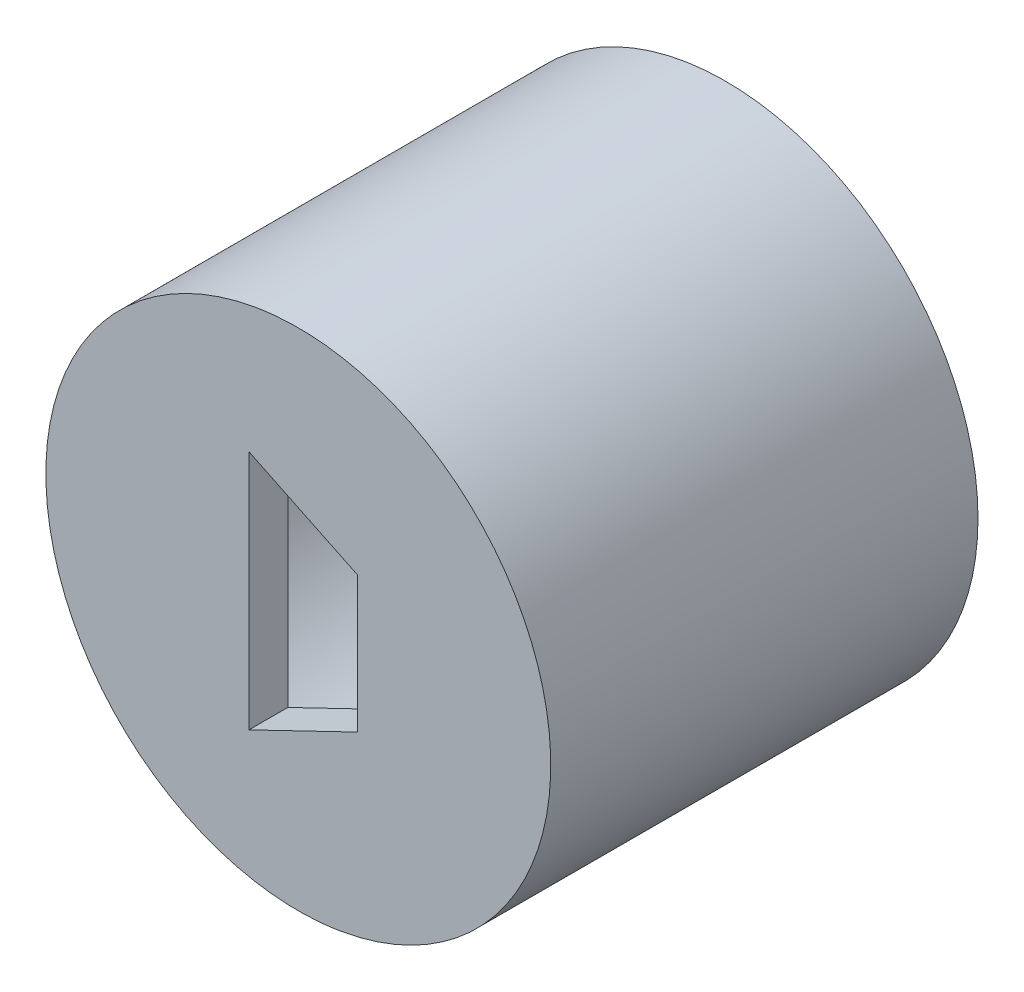
ISO-10303-21;
HEADER;
FILE_DESCRIPTION(('STEP AP214'),'2;1');
FILE_NAME('part.step','',(''),(''),'','','');
FILE_SCHEMA(('AUTOMOTIVE_DESIGN { 1 0 10303 214 1 1 1 1 }'));
ENDSEC;
DATA;
#1=APPLICATION_CONTEXT('core data for automotive mechanical design processes');
#2=APPLICATION_PROTOCOL_DEFINITION('international standard','automotive_design',2000,#1);
#3=PRODUCT_CONTEXT('',#1,'mechanical');
#4=PRODUCT('Part','Part','',(#3));
#5=PRODUCT_RELATED_PRODUCT_CATEGORY('part','',(#4));
#6=PRODUCT_DEFINITION_FORMATION('','',#4);
#7=PRODUCT_DEFINITION_CONTEXT('part definition',#1,'design');
#8=PRODUCT_DEFINITION('design','',#6,#7);
#9=PRODUCT_DEFINITION_SHAPE('','',#8);
#10=(LENGTH_UNIT() NAMED_UNIT(*) SI_UNIT(.MILLI.,.METRE.));
#11=(NAMED_UNIT(*) PLANE_ANGLE_UNIT() SI_UNIT($,.RADIAN.));
#12=(NAMED_UNIT(*) SI_UNIT($,.STERADIAN.) SOLID_ANGLE_UNIT());
#13=UNCERTAINTY_MEASURE_WITH_UNIT(LENGTH_MEASURE(1.E-05),#10,'distance_accuracy_value','');
#14=(GEOMETRIC_REPRESENTATION_CONTEXT(3) GLOBAL_UNCERTAINTY_ASSIGNED_CONTEXT((#13)) GLOBAL_UNIT_ASSIGNED_CONTEXT((#10,
#11,#12)) REPRESENTATION_CONTEXT('',''));
#15=CARTESIAN_POINT('',(0.,0.,0.));
#16=DIRECTION('',(0.,0.,1.));
#17=DIRECTION('',(1.,0.,0.));
#18=AXIS2_PLACEMENT_3D('',#15,#16,#17);
#19=CARTESIAN_POINT('',(0.,0.,11.));
#20=DIRECTION('',(0.,0.,1.));
#21=DIRECTION('',(1.,0.,0.));
#22=AXIS2_PLACEMENT_3D('',#19,#20,#21);
#23=PLANE('',#22);
#24=DIRECTION('',(0.,1.,0.));
#25=VECTOR('',#24,1.);
#26=CARTESIAN_POINT('',(1.52989690721649,0.,11.));
#27=LINE('',#26,#25);
#28=CARTESIAN_POINT('',(1.52989690721649,-1.75,11.));
#29=VERTEX_POINT('',#28);
#30=CARTESIAN_POINT('',(1.52989690721649,1.75,11.));
#31=VERTEX_POINT('',#30);
#32=EDGE_CURVE('E398',#29,#31,#27,.T.);
#33=ORIENTED_EDGE('',*,*,#32,.F.);
#34=DIRECTION('',(-0.900768681368895,-0.434299185660003,0.));
#35=VECTOR('',#34,1.);
#36=CARTESIAN_POINT('',(0.973168135927768,-2.01842280044278,11.));
#37=LINE('',#36,#35);
#38=CARTESIAN_POINT('',(-1.2701030927835,-3.1,11.));
#39=VERTEX_POINT('',#38);
#40=EDGE_CURVE('E65',#29,#39,#37,.T.);
#41=ORIENTED_EDGE('',*,*,#40,.T.);
#42=DIRECTION('',(0.,1.,0.));
#43=VECTOR('',#42,1.);
#44=CARTESIAN_POINT('',(-1.27010309278351,0.,11.));
#45=LINE('',#44,#43);
#46=CARTESIAN_POINT('',(-1.27010309278351,3.1,11.));
#47=VERTEX_POINT('',#46);
#48=EDGE_CURVE('E393',#39,#47,#45,.T.);
#49=ORIENTED_EDGE('',*,*,#48,.T.);
#50=DIRECTION('',(-0.900768681368895,0.434299185660003,0.));
#51=VECTOR('',#50,1.);
#52=CARTESIAN_POINT('',(0.973168135927768,2.01842280044278,11.));
#53=LINE('',#52,#51);
#54=EDGE_CURVE('E288',#31,#47,#53,.T.);
#55=ORIENTED_EDGE('',*,*,#54,.F.);
#56=EDGE_LOOP('',(#33,#41,#49,#55));
#57=FACE_BOUND('',#56,.T.);
#58=CARTESIAN_POINT('',(0.,0.,11.));
#59=DIRECTION('',(0.,0.,1.));
#60=DIRECTION('',(1.,0.,0.));
#61=AXIS2_PLACEMENT_3D('',#58,#59,#60);
#62=CIRCLE('',#61,6.5);
#63=CARTESIAN_POINT('',(1.13578166916006,-6.4,11.));
#64=VERTEX_POINT('',#63);
#65=CARTESIAN_POINT('',(1.13578166916005,6.4,11.));
#66=VERTEX_POINT('',#65);
#67=EDGE_CURVE('E160',#64,#66,#62,.T.);
#68=ORIENTED_EDGE('',*,*,#67,.T.);
#69=CARTESIAN_POINT('',(1.13578166916005,6.4,11.));
#70=CARTESIAN_POINT('',(0.,6.6015625,11.));
#71=CARTESIAN_POINT('',(-1.13578166916005,6.4,11.));
#72=B_SPLINE_CURVE_WITH_KNOTS('',2,(#69,#70,#71),.UNSPECIFIED.,.F.,.F.,(3,3),(0.,1.),.UNSPECIFIED.);
#73=CARTESIAN_POINT('',(-1.13578166916005,6.4,11.));
#74=VERTEX_POINT('',#73);
#75=EDGE_CURVE('E155',#66,#74,#72,.T.);
#76=ORIENTED_EDGE('',*,*,#75,.T.);
#77=CARTESIAN_POINT('',(-1.13578166916005,-6.4,11.));
#78=VERTEX_POINT('',#77);
#79=EDGE_CURVE('E50',#74,#78,#62,.T.);
#80=ORIENTED_EDGE('',*,*,#79,.T.);
#81=CARTESIAN_POINT('',(-1.13578166916006,-6.4,11.));
#82=CARTESIAN_POINT('',(0.,-6.6015625,11.));
#83=CARTESIAN_POINT('',(1.13578166916005,-6.4,11.));
#84=B_SPLINE_CURVE_WITH_KNOTS('',2,(#81,#82,#83),.UNSPECIFIED.,.F.,.F.,(3,3),(0.,1.),.UNSPECIFIED.);
#85=EDGE_CURVE('E152',#78,#64,#84,.T.);
#86=ORIENTED_EDGE('',*,*,#85,.T.);
#87=EDGE_LOOP('',(#68,#76,#80,#86));
#88=FACE_BOUND('',#87,.T.);
#89=ADVANCED_FACE('F46',(#57,#88),#23,.T.);
#90=CARTESIAN_POINT('',(0.,0.,10.));
#91=DIRECTION('',(0.,0.,1.));
#92=DIRECTION('',(1.,0.,0.));
#93=AXIS2_PLACEMENT_3D('',#90,#91,#92);
#94=PLANE('',#93);
#95=CARTESIAN_POINT('',(0.,0.,10.));
#96=DIRECTION('',(0.,0.,1.));
#97=DIRECTION('',(1.,0.,0.));
#98=AXIS2_PLACEMENT_3D('',#95,#96,#97);
#99=CIRCLE('',#98,5.5);
#100=CARTESIAN_POINT('',(5.5,0.,10.));
#101=VERTEX_POINT('',#100);
#102=EDGE_CURVE('E166',#101,#101,#99,.T.);
#103=ORIENTED_EDGE('',*,*,#102,.F.);
#104=EDGE_LOOP('',(#103));
#105=FACE_BOUND('',#104,.T.);
#106=DIRECTION('',(-0.900768681368895,-0.434299185660003,0.));
#107=VECTOR('',#106,1.);
#108=CARTESIAN_POINT('',(0.973168135927769,-2.01842280044278,10.));
#109=LINE('',#108,#107);
#110=CARTESIAN_POINT('',(1.52989690721649,-1.75,10.));
#111=VERTEX_POINT('',#110);
#112=CARTESIAN_POINT('',(-1.2701030927835,-3.1,10.));
#113=VERTEX_POINT('',#112);
#114=EDGE_CURVE('E11',#111,#113,#109,.T.);
#115=ORIENTED_EDGE('',*,*,#114,.F.);
#116=DIRECTION('',(0.,1.,0.));
#117=VECTOR('',#116,1.);
#118=CARTESIAN_POINT('',(1.52989690721649,0.,10.));
#119=LINE('',#118,#117);
#120=CARTESIAN_POINT('',(1.52989690721649,1.75,10.));
#121=VERTEX_POINT('',#120);
#122=EDGE_CURVE('E159',#111,#121,#119,.T.);
#123=ORIENTED_EDGE('',*,*,#122,.T.);
#124=DIRECTION('',(-0.900768681368895,0.434299185660003,0.));
#125=VECTOR('',#124,1.);
#126=CARTESIAN_POINT('',(0.973168135927769,2.01842280044278,10.));
#127=LINE('',#126,#125);
#128=CARTESIAN_POINT('',(-1.27010309278351,3.1,10.));
#129=VERTEX_POINT('',#128);
#130=EDGE_CURVE('E284',#121,#129,#127,.T.);
#131=ORIENTED_EDGE('',*,*,#130,.T.);
#132=DIRECTION('',(0.,1.,0.));
#133=VECTOR('',#132,1.);
#134=CARTESIAN_POINT('',(-1.27010309278351,0.,10.));
#135=LINE('',#134,#133);
#136=EDGE_CURVE('E57',#113,#129,#135,.T.);
#137=ORIENTED_EDGE('',*,*,#136,.F.);
#138=EDGE_LOOP('',(#115,#123,#131,#137));
#139=FACE_BOUND('',#138,.T.);
#140=ADVANCED_FACE('F216',(#105,#139),#94,.F.);
#141=CARTESIAN_POINT('',(0.,0.,11.));
#142=DIRECTION('',(0.,0.,-1.));
#143=DIRECTION('',(-1.,0.,0.));
#144=AXIS2_PLACEMENT_3D('',#141,#142,#143);
#145=CYLINDRICAL_SURFACE('',#144,5.5);
#146=CARTESIAN_POINT('',(0.,0.,0.5));
#147=DIRECTION('',(0.,0.,-1.));
#148=DIRECTION('',(-1.,0.,0.));
#149=AXIS2_PLACEMENT_3D('',#146,#147,#148);
#150=CIRCLE('',#149,5.5);
#151=CARTESIAN_POINT('',(-5.5,0.,0.5));
#152=VERTEX_POINT('',#151);
#153=EDGE_CURVE('E198',#152,#152,#150,.T.);
#154=ORIENTED_EDGE('',*,*,#153,.T.);
#155=EDGE_LOOP('',(#154));
#156=FACE_BOUND('',#155,.T.);
#157=ORIENTED_EDGE('',*,*,#102,.T.);
#158=EDGE_LOOP('',(#157));
#159=FACE_BOUND('',#158,.T.);
#160=ADVANCED_FACE('F48',(#156,#159),#145,.F.);
#161=CARTESIAN_POINT('',(0.,0.,11.));
#162=DIRECTION('',(0.,0.,-1.));
#163=DIRECTION('',(-1.,0.,0.));
#164=AXIS2_PLACEMENT_3D('',#161,#162,#163);
#165=CYLINDRICAL_SURFACE('',#164,6.5);
#166=ORIENTED_EDGE('',*,*,#85,.F.);
#167=ORIENTED_EDGE('',*,*,#79,.F.);
#168=ORIENTED_EDGE('',*,*,#75,.F.);
#169=ORIENTED_EDGE('',*,*,#67,.F.);
#170=EDGE_LOOP('',(#166,#167,#168,#169));
#171=FACE_BOUND('',#170,.T.);
#172=CARTESIAN_POINT('',(0.,0.,0.));
#173=DIRECTION('',(0.,0.,1.));
#174=DIRECTION('',(1.,0.,0.));
#175=AXIS2_PLACEMENT_3D('',#172,#173,#174);
#176=CIRCLE('',#175,6.5);
#177=CARTESIAN_POINT('',(6.5,0.,0.));
#178=VERTEX_POINT('',#177);
#179=EDGE_CURVE('E194',#178,#178,#176,.T.);
#180=ORIENTED_EDGE('',*,*,#179,.T.);
#181=EDGE_LOOP('',(#180));
#182=FACE_BOUND('',#181,.T.);
#183=ADVANCED_FACE('F162',(#171,#182),#165,.T.);
#184=CARTESIAN_POINT('',(0.,0.,0.));
#185=DIRECTION('',(0.,0.,1.));
#186=DIRECTION('',(1.,0.,0.));
#187=AXIS2_PLACEMENT_3D('',#184,#185,#186);
#188=PLANE('',#187);
#189=ORIENTED_EDGE('',*,*,#179,.F.);
#190=EDGE_LOOP('',(#189));
#191=FACE_BOUND('',#190,.T.);
#192=CARTESIAN_POINT('',(-1.35,-1.7,0.));
#193=DIRECTION('',(0.,0.,-1.));
#194=DIRECTION('',(-1.,0.,0.));
#195=AXIS2_PLACEMENT_3D('',#192,#193,#194);
#196=CIRCLE('',#195,0.1);
#197=CARTESIAN_POINT('',(-1.35,-1.8,0.));
#198=VERTEX_POINT('',#197);
#199=CARTESIAN_POINT('',(-1.45,-1.7,0.));
#200=VERTEX_POINT('',#199);
#201=EDGE_CURVE('E165',#198,#200,#196,.T.);
#202=ORIENTED_EDGE('',*,*,#201,.F.);
#203=DIRECTION('',(-1.,0.,0.));
#204=VECTOR('',#203,1.);
#205=CARTESIAN_POINT('',(1.35,-1.8,0.));
#206=LINE('',#205,#204);
#207=CARTESIAN_POINT('',(1.35,-1.8,0.));
#208=VERTEX_POINT('',#207);
#209=EDGE_CURVE('E352',#208,#198,#206,.T.);
#210=ORIENTED_EDGE('',*,*,#209,.F.);
#211=CARTESIAN_POINT('',(1.35,-1.7,0.));
#212=DIRECTION('',(0.,0.,-1.));
#213=DIRECTION('',(1.,0.,0.));
#214=AXIS2_PLACEMENT_3D('',#211,#212,#213);
#215=CIRCLE('',#214,0.1);
#216=CARTESIAN_POINT('',(1.45,-1.7,0.));
#217=VERTEX_POINT('',#216);
#218=EDGE_CURVE('E356',#217,#208,#215,.T.);
#219=ORIENTED_EDGE('',*,*,#218,.F.);
#220=DIRECTION('',(0.,-1.,0.));
#221=VECTOR('',#220,1.);
#222=CARTESIAN_POINT('',(1.45,-1.7,0.));
#223=LINE('',#222,#221);
#224=CARTESIAN_POINT('',(1.45,1.7,0.));
#225=VERTEX_POINT('',#224);
#226=EDGE_CURVE('E360',#225,#217,#223,.T.);
#227=ORIENTED_EDGE('',*,*,#226,.F.);
#228=CARTESIAN_POINT('',(1.35,1.7,0.));
#229=DIRECTION('',(0.,0.,-1.));
#230=DIRECTION('',(1.,0.,0.));
#231=AXIS2_PLACEMENT_3D('',#228,#229,#230);
#232=CIRCLE('',#231,0.1);
#233=CARTESIAN_POINT('',(1.35,1.8,0.));
#234=VERTEX_POINT('',#233);
#235=EDGE_CURVE('E364',#234,#225,#232,.T.);
#236=ORIENTED_EDGE('',*,*,#235,.F.);
#237=DIRECTION('',(1.,0.,0.));
#238=VECTOR('',#237,1.);
#239=CARTESIAN_POINT('',(1.35,1.8,0.));
#240=LINE('',#239,#238);
#241=CARTESIAN_POINT('',(-1.35,1.8,0.));
#242=VERTEX_POINT('',#241);
#243=EDGE_CURVE('E368',#242,#234,#240,.T.);
#244=ORIENTED_EDGE('',*,*,#243,.F.);
#245=CARTESIAN_POINT('',(-1.35,1.7,0.));
#246=DIRECTION('',(0.,0.,-1.));
#247=DIRECTION('',(1.,0.,0.));
#248=AXIS2_PLACEMENT_3D('',#245,#246,#247);
#249=CIRCLE('',#248,0.1);
#250=CARTESIAN_POINT('',(-1.45,1.7,0.));
#251=VERTEX_POINT('',#250);
#252=EDGE_CURVE('E372',#251,#242,#249,.T.);
#253=ORIENTED_EDGE('',*,*,#252,.F.);
#254=DIRECTION('',(0.,1.,0.));
#255=VECTOR('',#254,1.);
#256=CARTESIAN_POINT('',(-1.45,-1.7,0.));
#257=LINE('',#256,#255);
#258=EDGE_CURVE('E376',#200,#251,#257,.T.);
#259=ORIENTED_EDGE('',*,*,#258,.F.);
#260=EDGE_LOOP('',(#202,#210,#219,#227,#236,#244,#253,#259));
#261=FACE_BOUND('',#260,.T.);
#262=ADVANCED_FACE('F184',(#191,#261),#188,.F.);
#263=CARTESIAN_POINT('',(0.,0.,0.5));
#264=DIRECTION('',(0.,0.,-1.));
#265=DIRECTION('',(-1.,0.,0.));
#266=AXIS2_PLACEMENT_3D('',#263,#264,#265);
#267=PLANE('',#266);
#268=ORIENTED_EDGE('',*,*,#153,.F.);
#269=EDGE_LOOP('',(#268));
#270=FACE_BOUND('',#269,.T.);
#271=DIRECTION('',(-1.,0.,0.));
#272=VECTOR('',#271,1.);
#273=CARTESIAN_POINT('',(1.35,-1.8,0.5));
#274=LINE('',#273,#272);
#275=CARTESIAN_POINT('',(1.35,-1.8,0.5));
#276=VERTEX_POINT('',#275);
#277=CARTESIAN_POINT('',(-1.35,-1.8,0.5));
#278=VERTEX_POINT('',#277);
#279=EDGE_CURVE('E321',#276,#278,#274,.T.);
#280=ORIENTED_EDGE('',*,*,#279,.T.);
#281=CARTESIAN_POINT('',(-1.35,-1.7,0.5));
#282=DIRECTION('',(0.,0.,-1.));
#283=DIRECTION('',(-1.,0.,0.));
#284=AXIS2_PLACEMENT_3D('',#281,#282,#283);
#285=CIRCLE('',#284,0.1);
#286=CARTESIAN_POINT('',(-1.45,-1.7,0.5));
#287=VERTEX_POINT('',#286);
#288=EDGE_CURVE('E348',#278,#287,#285,.T.);
#289=ORIENTED_EDGE('',*,*,#288,.T.);
#290=DIRECTION('',(0.,1.,0.));
#291=VECTOR('',#290,1.);
#292=CARTESIAN_POINT('',(-1.45,-1.7,0.5));
#293=LINE('',#292,#291);
#294=CARTESIAN_POINT('',(-1.45,1.7,0.5));
#295=VERTEX_POINT('',#294);
#296=EDGE_CURVE('E344',#287,#295,#293,.T.);
#297=ORIENTED_EDGE('',*,*,#296,.T.);
#298=CARTESIAN_POINT('',(-1.35,1.7,0.5));
#299=DIRECTION('',(0.,0.,-1.));
#300=DIRECTION('',(1.,0.,0.));
#301=AXIS2_PLACEMENT_3D('',#298,#299,#300);
#302=CIRCLE('',#301,0.1);
#303=CARTESIAN_POINT('',(-1.35,1.8,0.5));
#304=VERTEX_POINT('',#303);
#305=EDGE_CURVE('E340',#295,#304,#302,.T.);
#306=ORIENTED_EDGE('',*,*,#305,.T.);
#307=DIRECTION('',(1.,0.,0.));
#308=VECTOR('',#307,1.);
#309=CARTESIAN_POINT('',(1.35,1.8,0.5));
#310=LINE('',#309,#308);
#311=CARTESIAN_POINT('',(1.35,1.8,0.5));
#312=VERTEX_POINT('',#311);
#313=EDGE_CURVE('E336',#304,#312,#310,.T.);
#314=ORIENTED_EDGE('',*,*,#313,.T.);
#315=CARTESIAN_POINT('',(1.35,1.7,0.5));
#316=DIRECTION('',(0.,0.,-1.));
#317=DIRECTION('',(1.,0.,0.));
#318=AXIS2_PLACEMENT_3D('',#315,#316,#317);
#319=CIRCLE('',#318,0.1);
#320=CARTESIAN_POINT('',(1.45,1.7,0.5));
#321=VERTEX_POINT('',#320);
#322=EDGE_CURVE('E332',#312,#321,#319,.T.);
#323=ORIENTED_EDGE('',*,*,#322,.T.);
#324=DIRECTION('',(0.,-1.,0.));
#325=VECTOR('',#324,1.);
#326=CARTESIAN_POINT('',(1.45,-1.7,0.5));
#327=LINE('',#326,#325);
#328=CARTESIAN_POINT('',(1.45,-1.7,0.5));
#329=VERTEX_POINT('',#328);
#330=EDGE_CURVE('E328',#321,#329,#327,.T.);
#331=ORIENTED_EDGE('',*,*,#330,.T.);
#332=CARTESIAN_POINT('',(1.35,-1.7,0.5));
#333=DIRECTION('',(0.,0.,-1.));
#334=DIRECTION('',(1.,0.,0.));
#335=AXIS2_PLACEMENT_3D('',#332,#333,#334);
#336=CIRCLE('',#335,0.1);
#337=EDGE_CURVE('E324',#329,#276,#336,.T.);
#338=ORIENTED_EDGE('',*,*,#337,.T.);
#339=EDGE_LOOP('',(#280,#289,#297,#306,#314,#323,#331,#338));
#340=FACE_BOUND('',#339,.T.);
#341=ADVANCED_FACE('F218',(#270,#340),#267,.F.);
#342=CARTESIAN_POINT('',(-1.35,-1.7,0.5));
#343=DIRECTION('',(0.,0.,-1.));
#344=DIRECTION('',(-1.,0.,0.));
#345=AXIS2_PLACEMENT_3D('',#342,#343,#344);
#346=CYLINDRICAL_SURFACE('',#345,0.1);
#347=ORIENTED_EDGE('',*,*,#201,.T.);
#348=DIRECTION('',(0.,0.,-1.));
#349=VECTOR('',#348,1.);
#350=CARTESIAN_POINT('',(-1.45,-1.7,0.5));
#351=LINE('',#350,#349);
#352=EDGE_CURVE('E317',#287,#200,#351,.T.);
#353=ORIENTED_EDGE('',*,*,#352,.F.);
#354=ORIENTED_EDGE('',*,*,#288,.F.);
#355=DIRECTION('',(0.,0.,-1.));
#356=VECTOR('',#355,1.);
#357=CARTESIAN_POINT('',(-1.35,-1.8,0.5));
#358=LINE('',#357,#356);
#359=EDGE_CURVE('E297',#278,#198,#358,.T.);
#360=ORIENTED_EDGE('',*,*,#359,.T.);
#361=EDGE_LOOP('',(#347,#353,#354,#360));
#362=FACE_BOUND('',#361,.T.);
#363=ADVANCED_FACE('F222',(#362),#346,.F.);
#364=CARTESIAN_POINT('',(1.35,-1.8,0.5));
#365=DIRECTION('',(0.,-1.,0.));
#366=DIRECTION('',(0.,0.,-1.));
#367=AXIS2_PLACEMENT_3D('',#364,#365,#366);
#368=PLANE('',#367);
#369=ORIENTED_EDGE('',*,*,#209,.T.);
#370=ORIENTED_EDGE('',*,*,#359,.F.);
#371=ORIENTED_EDGE('',*,*,#279,.F.);
#372=DIRECTION('',(0.,0.,-1.));
#373=VECTOR('',#372,1.);
#374=CARTESIAN_POINT('',(1.35,-1.8,0.5));
#375=LINE('',#374,#373);
#376=EDGE_CURVE('E299',#276,#208,#375,.T.);
#377=ORIENTED_EDGE('',*,*,#376,.T.);
#378=EDGE_LOOP('',(#369,#370,#371,#377));
#379=FACE_BOUND('',#378,.T.);
#380=ADVANCED_FACE('F226',(#379),#368,.F.);
#381=CARTESIAN_POINT('',(1.35,-1.7,0.5));
#382=DIRECTION('',(0.,0.,-1.));
#383=DIRECTION('',(-1.,0.,0.));
#384=AXIS2_PLACEMENT_3D('',#381,#382,#383);
#385=CYLINDRICAL_SURFACE('',#384,0.1);
#386=ORIENTED_EDGE('',*,*,#218,.T.);
#387=ORIENTED_EDGE('',*,*,#376,.F.);
#388=ORIENTED_EDGE('',*,*,#337,.F.);
#389=DIRECTION('',(0.,0.,-1.));
#390=VECTOR('',#389,1.);
#391=CARTESIAN_POINT('',(1.45,-1.7,0.5));
#392=LINE('',#391,#390);
#393=EDGE_CURVE('E302',#329,#217,#392,.T.);
#394=ORIENTED_EDGE('',*,*,#393,.T.);
#395=EDGE_LOOP('',(#386,#387,#388,#394));
#396=FACE_BOUND('',#395,.T.);
#397=ADVANCED_FACE('F248',(#396),#385,.F.);
#398=CARTESIAN_POINT('',(1.45,-1.7,0.5));
#399=DIRECTION('',(1.,0.,0.));
#400=DIRECTION('',(0.,0.,-1.));
#401=AXIS2_PLACEMENT_3D('',#398,#399,#400);
#402=PLANE('',#401);
#403=ORIENTED_EDGE('',*,*,#226,.T.);
#404=ORIENTED_EDGE('',*,*,#393,.F.);
#405=ORIENTED_EDGE('',*,*,#330,.F.);
#406=DIRECTION('',(0.,0.,-1.));
#407=VECTOR('',#406,1.);
#408=CARTESIAN_POINT('',(1.45,1.7,0.5));
#409=LINE('',#408,#407);
#410=EDGE_CURVE('E305',#321,#225,#409,.T.);
#411=ORIENTED_EDGE('',*,*,#410,.T.);
#412=EDGE_LOOP('',(#403,#404,#405,#411));
#413=FACE_BOUND('',#412,.T.);
#414=ADVANCED_FACE('F244',(#413),#402,.F.);
#415=CARTESIAN_POINT('',(1.35,1.7,0.5));
#416=DIRECTION('',(0.,0.,-1.));
#417=DIRECTION('',(-1.,0.,0.));
#418=AXIS2_PLACEMENT_3D('',#415,#416,#417);
#419=CYLINDRICAL_SURFACE('',#418,0.1);
#420=ORIENTED_EDGE('',*,*,#235,.T.);
#421=ORIENTED_EDGE('',*,*,#410,.F.);
#422=ORIENTED_EDGE('',*,*,#322,.F.);
#423=DIRECTION('',(0.,0.,-1.));
#424=VECTOR('',#423,1.);
#425=CARTESIAN_POINT('',(1.35,1.8,0.5));
#426=LINE('',#425,#424);
#427=EDGE_CURVE('E308',#312,#234,#426,.T.);
#428=ORIENTED_EDGE('',*,*,#427,.T.);
#429=EDGE_LOOP('',(#420,#421,#422,#428));
#430=FACE_BOUND('',#429,.T.);
#431=ADVANCED_FACE('F240',(#430),#419,.F.);
#432=CARTESIAN_POINT('',(1.35,1.8,0.5));
#433=DIRECTION('',(0.,1.,0.));
#434=DIRECTION('',(0.,0.,1.));
#435=AXIS2_PLACEMENT_3D('',#432,#433,#434);
#436=PLANE('',#435);
#437=ORIENTED_EDGE('',*,*,#243,.T.);
#438=ORIENTED_EDGE('',*,*,#427,.F.);
#439=ORIENTED_EDGE('',*,*,#313,.F.);
#440=DIRECTION('',(0.,0.,-1.));
#441=VECTOR('',#440,1.);
#442=CARTESIAN_POINT('',(-1.35,1.8,0.5));
#443=LINE('',#442,#441);
#444=EDGE_CURVE('E311',#304,#242,#443,.T.);
#445=ORIENTED_EDGE('',*,*,#444,.T.);
#446=EDGE_LOOP('',(#437,#438,#439,#445));
#447=FACE_BOUND('',#446,.T.);
#448=ADVANCED_FACE('F236',(#447),#436,.F.);
#449=CARTESIAN_POINT('',(-1.35,1.7,0.5));
#450=DIRECTION('',(0.,0.,-1.));
#451=DIRECTION('',(-1.,0.,0.));
#452=AXIS2_PLACEMENT_3D('',#449,#450,#451);
#453=CYLINDRICAL_SURFACE('',#452,0.1);
#454=ORIENTED_EDGE('',*,*,#252,.T.);
#455=ORIENTED_EDGE('',*,*,#444,.F.);
#456=ORIENTED_EDGE('',*,*,#305,.F.);
#457=DIRECTION('',(0.,0.,-1.));
#458=VECTOR('',#457,1.);
#459=CARTESIAN_POINT('',(-1.45,1.7,0.5));
#460=LINE('',#459,#458);
#461=EDGE_CURVE('E314',#295,#251,#460,.T.);
#462=ORIENTED_EDGE('',*,*,#461,.T.);
#463=EDGE_LOOP('',(#454,#455,#456,#462));
#464=FACE_BOUND('',#463,.T.);
#465=ADVANCED_FACE('F232',(#464),#453,.F.);
#466=CARTESIAN_POINT('',(-1.45,-1.7,0.5));
#467=DIRECTION('',(-1.,0.,0.));
#468=DIRECTION('',(0.,0.,1.));
#469=AXIS2_PLACEMENT_3D('',#466,#467,#468);
#470=PLANE('',#469);
#471=ORIENTED_EDGE('',*,*,#258,.T.);
#472=ORIENTED_EDGE('',*,*,#461,.F.);
#473=ORIENTED_EDGE('',*,*,#296,.F.);
#474=ORIENTED_EDGE('',*,*,#352,.T.);
#475=EDGE_LOOP('',(#471,#472,#473,#474));
#476=FACE_BOUND('',#475,.T.);
#477=ADVANCED_FACE('F228',(#476),#470,.F.);
#478=CARTESIAN_POINT('',(0.973168135927768,-2.01842280044278,0.999999999999999));
#479=DIRECTION('',(-0.434299185660003,0.900768681368895,0.));
#480=DIRECTION('',(-0.900768681368895,-0.434299185660003,0.));
#481=AXIS2_PLACEMENT_3D('',#478,#479,#480);
#482=PLANE('',#481);
#483=ORIENTED_EDGE('',*,*,#114,.T.);
#484=DIRECTION('',(0.,0.,1.));
#485=VECTOR('',#484,1.);
#486=CARTESIAN_POINT('',(-1.2701030927835,-3.1,0.999999999999999));
#487=LINE('',#486,#485);
#488=EDGE_CURVE('E279',#113,#39,#487,.T.);
#489=ORIENTED_EDGE('',*,*,#488,.T.);
#490=ORIENTED_EDGE('',*,*,#40,.F.);
#491=DIRECTION('',(0.,0.,1.));
#492=VECTOR('',#491,1.);
#493=CARTESIAN_POINT('',(1.52989690721649,-1.75,0.999999999999999));
#494=LINE('',#493,#492);
#495=EDGE_CURVE('E390',#111,#29,#494,.T.);
#496=ORIENTED_EDGE('',*,*,#495,.F.);
#497=EDGE_LOOP('',(#483,#489,#490,#496));
#498=FACE_BOUND('',#497,.T.);
#499=ADVANCED_FACE('F231',(#498),#482,.T.);
#500=CARTESIAN_POINT('',(-1.27010309278351,0.,0.999999999999999));
#501=DIRECTION('',(1.,0.,0.));
#502=DIRECTION('',(0.,0.,-1.));
#503=AXIS2_PLACEMENT_3D('',#500,#501,#502);
#504=PLANE('',#503);
#505=ORIENTED_EDGE('',*,*,#136,.T.);
#506=DIRECTION('',(0.,0.,1.));
#507=VECTOR('',#506,1.);
#508=CARTESIAN_POINT('',(-1.27010309278351,3.1,0.999999999999999));
#509=LINE('',#508,#507);
#510=EDGE_CURVE('E277',#129,#47,#509,.T.);
#511=ORIENTED_EDGE('',*,*,#510,.T.);
#512=ORIENTED_EDGE('',*,*,#48,.F.);
#513=ORIENTED_EDGE('',*,*,#488,.F.);
#514=EDGE_LOOP('',(#505,#511,#512,#513));
#515=FACE_BOUND('',#514,.T.);
#516=ADVANCED_FACE('F261',(#515),#504,.T.);
#517=CARTESIAN_POINT('',(0.973168135927768,2.01842280044278,0.999999999999999));
#518=DIRECTION('',(0.434299185660003,0.900768681368895,0.));
#519=DIRECTION('',(-0.900768681368895,0.434299185660003,0.));
#520=AXIS2_PLACEMENT_3D('',#517,#518,#519);
#521=PLANE('',#520);
#522=DIRECTION('',(0.,0.,1.));
#523=VECTOR('',#522,1.);
#524=CARTESIAN_POINT('',(1.52989690721649,1.75,0.999999999999999));
#525=LINE('',#524,#523);
#526=EDGE_CURVE('E73',#121,#31,#525,.T.);
#527=ORIENTED_EDGE('',*,*,#526,.T.);
#528=ORIENTED_EDGE('',*,*,#54,.T.);
#529=ORIENTED_EDGE('',*,*,#510,.F.);
#530=ORIENTED_EDGE('',*,*,#130,.F.);
#531=EDGE_LOOP('',(#527,#528,#529,#530));
#532=FACE_BOUND('',#531,.T.);
#533=ADVANCED_FACE('F265',(#532),#521,.F.);
#534=CARTESIAN_POINT('',(1.52989690721649,0.,0.999999999999999));
#535=DIRECTION('',(1.,0.,0.));
#536=DIRECTION('',(0.,0.,-1.));
#537=AXIS2_PLACEMENT_3D('',#534,#535,#536);
#538=PLANE('',#537);
#539=ORIENTED_EDGE('',*,*,#495,.T.);
#540=ORIENTED_EDGE('',*,*,#32,.T.);
#541=ORIENTED_EDGE('',*,*,#526,.F.);
#542=ORIENTED_EDGE('',*,*,#122,.F.);
#543=EDGE_LOOP('',(#539,#540,#541,#542));
#544=FACE_BOUND('',#543,.T.);
#545=ADVANCED_FACE('F262',(#544),#538,.F.);
#546=CLOSED_SHELL('',(#89,#140,#160,#183,#262,#341,#363,#380,#397,#414,#431,#448,#465,#477,#499,
#516,#533,#545));
#547=MANIFOLD_SOLID_BREP('B2',#546);
#548=ADVANCED_BREP_SHAPE_REPRESENTATION('',(#18,#547),#14);
#549=SHAPE_DEFINITION_REPRESENTATION(#9,#548);
ENDSEC;
END-ISO-10303-21;
